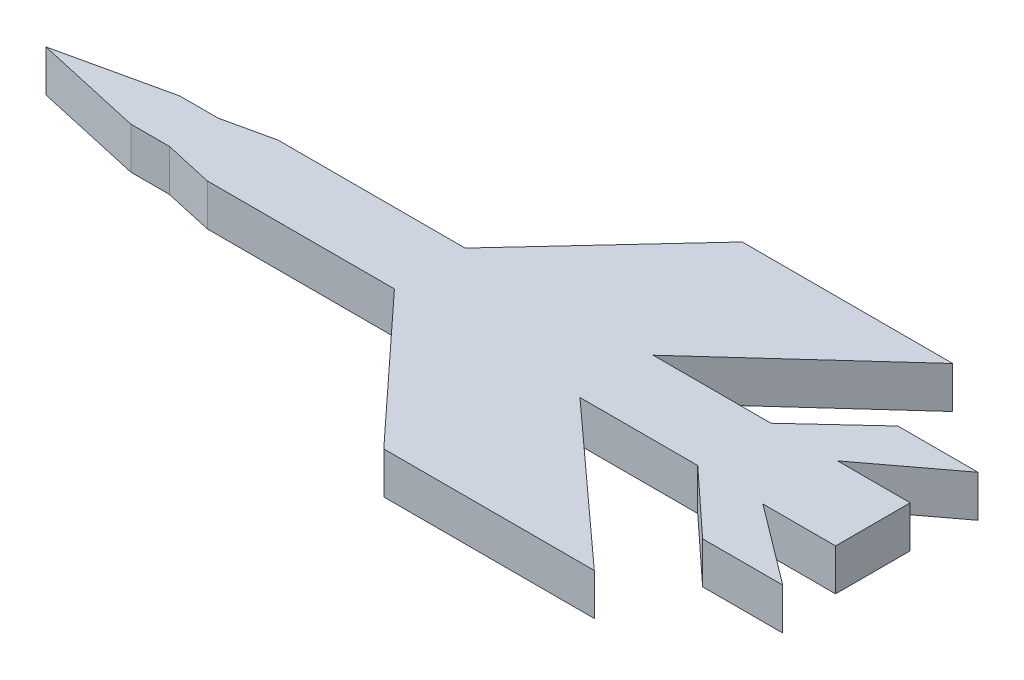
ISO-10303-21;
HEADER;
FILE_DESCRIPTION(('STEP AP214'),'2;1');
FILE_NAME('part.step','',(''),(''),'','','');
FILE_SCHEMA(('AUTOMOTIVE_DESIGN { 1 0 10303 214 1 1 1 1 }'));
ENDSEC;
DATA;
#1=APPLICATION_CONTEXT('core data for automotive mechanical design processes');
#2=APPLICATION_PROTOCOL_DEFINITION('international standard','automotive_design',2000,#1);
#3=PRODUCT_CONTEXT('',#1,'mechanical');
#4=PRODUCT('Part','Part','',(#3));
#5=PRODUCT_RELATED_PRODUCT_CATEGORY('part','',(#4));
#6=PRODUCT_DEFINITION_FORMATION('','',#4);
#7=PRODUCT_DEFINITION_CONTEXT('part definition',#1,'design');
#8=PRODUCT_DEFINITION('design','',#6,#7);
#9=PRODUCT_DEFINITION_SHAPE('','',#8);
#10=(LENGTH_UNIT() NAMED_UNIT(*) SI_UNIT(.MILLI.,.METRE.));
#11=(NAMED_UNIT(*) PLANE_ANGLE_UNIT() SI_UNIT($,.RADIAN.));
#12=(NAMED_UNIT(*) SI_UNIT($,.STERADIAN.) SOLID_ANGLE_UNIT());
#13=UNCERTAINTY_MEASURE_WITH_UNIT(LENGTH_MEASURE(1.E-05),#10,'distance_accuracy_value','');
#14=(GEOMETRIC_REPRESENTATION_CONTEXT(3) GLOBAL_UNCERTAINTY_ASSIGNED_CONTEXT((#13)) GLOBAL_UNIT_ASSIGNED_CONTEXT((#10,
#11,#12)) REPRESENTATION_CONTEXT('',''));
#15=CARTESIAN_POINT('',(0.,0.,0.));
#16=DIRECTION('',(0.,0.,1.));
#17=DIRECTION('',(1.,0.,0.));
#18=AXIS2_PLACEMENT_3D('',#15,#16,#17);
#19=CARTESIAN_POINT('',(2.19655905326022,2.,0.));
#20=DIRECTION('',(0.218155907395046,0.,-0.975913930666349));
#21=DIRECTION('',(-0.975913930666349,0.,-0.218155907395046));
#22=AXIS2_PLACEMENT_3D('',#19,#20,#21);
#23=PLANE('',#22);
#24=DIRECTION('',(0.975913930666349,0.,0.218155907395046));
#25=VECTOR('',#24,1.);
#26=CARTESIAN_POINT('',(2.19655905326022,0.,0.));
#27=LINE('',#26,#25);
#28=CARTESIAN_POINT('',(2.19655905326022,0.,0.));
#29=VERTEX_POINT('',#28);
#30=CARTESIAN_POINT('',(7.45293129646285,0.,1.17501002935683));
#31=VERTEX_POINT('',#30);
#32=EDGE_CURVE('E242',#29,#31,#27,.T.);
#33=ORIENTED_EDGE('',*,*,#32,.T.);
#34=DIRECTION('',(0.,-1.,0.));
#35=VECTOR('',#34,1.);
#36=CARTESIAN_POINT('',(7.45293129646285,2.,1.17501002935683));
#37=LINE('',#36,#35);
#38=CARTESIAN_POINT('',(7.45293129646285,2.,1.17501002935683));
#39=VERTEX_POINT('',#38);
#40=EDGE_CURVE('E11',#39,#31,#37,.T.);
#41=ORIENTED_EDGE('',*,*,#40,.F.);
#42=DIRECTION('',(0.975913930666349,0.,0.218155907395046));
#43=VECTOR('',#42,1.);
#44=CARTESIAN_POINT('',(2.19655905326022,2.,0.));
#45=LINE('',#44,#43);
#46=CARTESIAN_POINT('',(2.19655905326022,2.,0.));
#47=VERTEX_POINT('',#46);
#48=EDGE_CURVE('E315',#47,#39,#45,.T.);
#49=ORIENTED_EDGE('',*,*,#48,.F.);
#50=DIRECTION('',(0.,-1.,0.));
#51=VECTOR('',#50,1.);
#52=CARTESIAN_POINT('',(2.19655905326022,2.,0.));
#53=LINE('',#52,#51);
#54=EDGE_CURVE('E238',#47,#29,#53,.T.);
#55=ORIENTED_EDGE('',*,*,#54,.T.);
#56=EDGE_LOOP('',(#33,#41,#49,#55));
#57=FACE_BOUND('',#56,.T.);
#58=ADVANCED_FACE('F39',(#57),#23,.F.);
#59=CARTESIAN_POINT('',(7.45293129646285,2.,1.17501002935683));
#60=DIRECTION('',(0.,0.,-1.));
#61=DIRECTION('',(-1.,0.,0.));
#62=AXIS2_PLACEMENT_3D('',#59,#60,#61);
#63=PLANE('',#62);
#64=DIRECTION('',(1.,0.,0.));
#65=VECTOR('',#64,1.);
#66=CARTESIAN_POINT('',(7.45293129646285,0.,1.17501002935683));
#67=LINE('',#66,#65);
#68=CARTESIAN_POINT('',(9.30359409427219,0.,1.17501002935683));
#69=VERTEX_POINT('',#68);
#70=EDGE_CURVE('E246',#31,#69,#67,.T.);
#71=ORIENTED_EDGE('',*,*,#70,.T.);
#72=DIRECTION('',(0.,-1.,0.));
#73=VECTOR('',#72,1.);
#74=CARTESIAN_POINT('',(9.30359409427219,2.,1.17501002935683));
#75=LINE('',#74,#73);
#76=CARTESIAN_POINT('',(9.30359409427219,2.,1.17501002935683));
#77=VERTEX_POINT('',#76);
#78=EDGE_CURVE('E48',#77,#69,#75,.T.);
#79=ORIENTED_EDGE('',*,*,#78,.F.);
#80=DIRECTION('',(1.,0.,0.));
#81=VECTOR('',#80,1.);
#82=CARTESIAN_POINT('',(7.45293129646285,2.,1.17501002935683));
#83=LINE('',#82,#81);
#84=EDGE_CURVE('E150',#39,#77,#83,.T.);
#85=ORIENTED_EDGE('',*,*,#84,.F.);
#86=ORIENTED_EDGE('',*,*,#40,.T.);
#87=EDGE_LOOP('',(#71,#79,#85,#86));
#88=FACE_BOUND('',#87,.T.);
#89=ADVANCED_FACE('F500',(#88),#63,.F.);
#90=CARTESIAN_POINT('',(9.30359409427219,2.,1.17501002935683));
#91=DIRECTION('',(0.218155907395046,0.,-0.975913930666349));
#92=DIRECTION('',(-0.975913930666349,0.,-0.218155907395046));
#93=AXIS2_PLACEMENT_3D('',#90,#91,#92);
#94=PLANE('',#93);
#95=DIRECTION('',(0.975913930666349,0.,0.218155907395046));
#96=VECTOR('',#95,1.);
#97=CARTESIAN_POINT('',(9.30359409427219,0.,1.17501002935683));
#98=LINE('',#97,#96);
#99=CARTESIAN_POINT('',(11.6510988990228,0.,1.69977151159628));
#100=VERTEX_POINT('',#99);
#101=EDGE_CURVE('E249',#69,#100,#98,.T.);
#102=ORIENTED_EDGE('',*,*,#101,.T.);
#103=DIRECTION('',(0.,-1.,0.));
#104=VECTOR('',#103,1.);
#105=CARTESIAN_POINT('',(11.6510988990228,2.,1.69977151159628));
#106=LINE('',#105,#104);
#107=CARTESIAN_POINT('',(11.6510988990228,2.,1.69977151159628));
#108=VERTEX_POINT('',#107);
#109=EDGE_CURVE('E394',#108,#100,#106,.T.);
#110=ORIENTED_EDGE('',*,*,#109,.F.);
#111=DIRECTION('',(0.975913930666349,0.,0.218155907395046));
#112=VECTOR('',#111,1.);
#113=CARTESIAN_POINT('',(9.30359409427219,2.,1.17501002935683));
#114=LINE('',#113,#112);
#115=EDGE_CURVE('E404',#77,#108,#114,.T.);
#116=ORIENTED_EDGE('',*,*,#115,.F.);
#117=ORIENTED_EDGE('',*,*,#78,.T.);
#118=EDGE_LOOP('',(#102,#110,#116,#117));
#119=FACE_BOUND('',#118,.T.);
#120=ADVANCED_FACE('F402',(#119),#94,.F.);
#121=CARTESIAN_POINT('',(11.6510988990228,2.,1.69977151159628));
#122=DIRECTION('',(0.,0.,-1.));
#123=DIRECTION('',(-1.,0.,0.));
#124=AXIS2_PLACEMENT_3D('',#121,#122,#123);
#125=PLANE('',#124);
#126=DIRECTION('',(1.,0.,0.));
#127=VECTOR('',#126,1.);
#128=CARTESIAN_POINT('',(11.6510988990228,0.,1.69977151159628));
#129=LINE('',#128,#127);
#130=CARTESIAN_POINT('',(20.6485779370225,0.,1.69977151159628));
#131=VERTEX_POINT('',#130);
#132=EDGE_CURVE('E252',#100,#131,#129,.T.);
#133=ORIENTED_EDGE('',*,*,#132,.T.);
#134=DIRECTION('',(0.,-1.,0.));
#135=VECTOR('',#134,1.);
#136=CARTESIAN_POINT('',(20.6485779370225,2.,1.69977151159628));
#137=LINE('',#136,#135);
#138=CARTESIAN_POINT('',(20.6485779370225,2.,1.69977151159628));
#139=VERTEX_POINT('',#138);
#140=EDGE_CURVE('E390',#139,#131,#137,.T.);
#141=ORIENTED_EDGE('',*,*,#140,.F.);
#142=DIRECTION('',(1.,0.,0.));
#143=VECTOR('',#142,1.);
#144=CARTESIAN_POINT('',(11.6510988990228,2.,1.69977151159628));
#145=LINE('',#144,#143);
#146=EDGE_CURVE('E423',#108,#139,#145,.T.);
#147=ORIENTED_EDGE('',*,*,#146,.F.);
#148=ORIENTED_EDGE('',*,*,#109,.T.);
#149=EDGE_LOOP('',(#133,#141,#147,#148));
#150=FACE_BOUND('',#149,.T.);
#151=ADVANCED_FACE('F413',(#150),#125,.F.);
#152=CARTESIAN_POINT('',(20.6485779370225,2.,1.69977151159628));
#153=DIRECTION('',(0.733707687649136,0.,-0.679465252301071));
#154=DIRECTION('',(-0.679465252301071,0.,-0.733707687649136));
#155=AXIS2_PLACEMENT_3D('',#152,#153,#154);
#156=PLANE('',#155);
#157=DIRECTION('',(0.679465252301071,0.,0.733707687649136));
#158=VECTOR('',#157,1.);
#159=CARTESIAN_POINT('',(20.6485779370225,0.,1.69977151159628));
#160=LINE('',#159,#158);
#161=CARTESIAN_POINT('',(27.0551507672145,0.,8.61778787972867));
#162=VERTEX_POINT('',#161);
#163=EDGE_CURVE('E255',#131,#162,#160,.T.);
#164=ORIENTED_EDGE('',*,*,#163,.T.);
#165=DIRECTION('',(0.,-1.,0.));
#166=VECTOR('',#165,1.);
#167=CARTESIAN_POINT('',(27.0551507672145,2.,8.61778787972867));
#168=LINE('',#167,#166);
#169=CARTESIAN_POINT('',(27.0551507672145,2.,8.61778787972867));
#170=VERTEX_POINT('',#169);
#171=EDGE_CURVE('E386',#170,#162,#168,.T.);
#172=ORIENTED_EDGE('',*,*,#171,.F.);
#173=DIRECTION('',(0.679465252301071,0.,0.733707687649136));
#174=VECTOR('',#173,1.);
#175=CARTESIAN_POINT('',(20.6485779370225,2.,1.69977151159628));
#176=LINE('',#175,#174);
#177=EDGE_CURVE('E419',#139,#170,#176,.T.);
#178=ORIENTED_EDGE('',*,*,#177,.F.);
#179=ORIENTED_EDGE('',*,*,#140,.T.);
#180=EDGE_LOOP('',(#164,#172,#178,#179));
#181=FACE_BOUND('',#180,.T.);
#182=ADVANCED_FACE('F417',(#181),#156,.F.);
#183=CARTESIAN_POINT('',(27.0551507672145,2.,8.61778787972867));
#184=DIRECTION('',(0.,0.,-1.));
#185=DIRECTION('',(-1.,0.,0.));
#186=AXIS2_PLACEMENT_3D('',#183,#184,#185);
#187=PLANE('',#186);
#188=DIRECTION('',(1.,0.,0.));
#189=VECTOR('',#188,1.);
#190=CARTESIAN_POINT('',(27.0551507672145,0.,8.61778787972867));
#191=LINE('',#190,#189);
#192=CARTESIAN_POINT('',(37.1766319500149,0.,8.61778787972867));
#193=VERTEX_POINT('',#192);
#194=EDGE_CURVE('E258',#162,#193,#191,.T.);
#195=ORIENTED_EDGE('',*,*,#194,.T.);
#196=DIRECTION('',(0.,-1.,0.));
#197=VECTOR('',#196,1.);
#198=CARTESIAN_POINT('',(37.1766319500149,2.,8.61778787972867));
#199=LINE('',#198,#197);
#200=CARTESIAN_POINT('',(37.1766319500149,2.,8.61778787972867));
#201=VERTEX_POINT('',#200);
#202=EDGE_CURVE('E382',#201,#193,#199,.T.);
#203=ORIENTED_EDGE('',*,*,#202,.F.);
#204=DIRECTION('',(1.,0.,0.));
#205=VECTOR('',#204,1.);
#206=CARTESIAN_POINT('',(27.0551507672145,2.,8.61778787972867));
#207=LINE('',#206,#205);
#208=EDGE_CURVE('E422',#170,#201,#207,.T.);
#209=ORIENTED_EDGE('',*,*,#208,.F.);
#210=ORIENTED_EDGE('',*,*,#171,.T.);
#211=EDGE_LOOP('',(#195,#203,#209,#210));
#212=FACE_BOUND('',#211,.T.);
#213=ADVANCED_FACE('F513',(#212),#187,.F.);
#214=CARTESIAN_POINT('',(37.1766319500149,2.,8.61778787972867));
#215=DIRECTION('',(-0.672408894273598,0.,0.740179896310186));
#216=DIRECTION('',(0.740179896310186,0.,0.672408894273598));
#217=AXIS2_PLACEMENT_3D('',#214,#215,#216);
#218=PLANE('',#217);
#219=DIRECTION('',(-0.740179896310186,0.,-0.672408894273598));
#220=VECTOR('',#219,1.);
#221=CARTESIAN_POINT('',(37.1766319500149,0.,8.61778787972867));
#222=LINE('',#221,#220);
#223=CARTESIAN_POINT('',(29.6276479759605,0.,1.75999021163875));
#224=VERTEX_POINT('',#223);
#225=EDGE_CURVE('E261',#193,#224,#222,.T.);
#226=ORIENTED_EDGE('',*,*,#225,.T.);
#227=DIRECTION('',(0.,-1.,0.));
#228=VECTOR('',#227,1.);
#229=CARTESIAN_POINT('',(29.6276479759605,2.,1.75999021163875));
#230=LINE('',#229,#228);
#231=CARTESIAN_POINT('',(29.6276479759605,2.,1.75999021163875));
#232=VERTEX_POINT('',#231);
#233=EDGE_CURVE('E378',#232,#224,#230,.T.);
#234=ORIENTED_EDGE('',*,*,#233,.F.);
#235=DIRECTION('',(-0.740179896310186,0.,-0.672408894273598));
#236=VECTOR('',#235,1.);
#237=CARTESIAN_POINT('',(37.1766319500149,2.,8.61778787972867));
#238=LINE('',#237,#236);
#239=EDGE_CURVE('E427',#201,#232,#238,.T.);
#240=ORIENTED_EDGE('',*,*,#239,.F.);
#241=ORIENTED_EDGE('',*,*,#202,.T.);
#242=EDGE_LOOP('',(#226,#234,#240,#241));
#243=FACE_BOUND('',#242,.T.);
#244=ADVANCED_FACE('F516',(#243),#218,.F.);
#245=CARTESIAN_POINT('',(29.6276479759605,2.,1.75999021163875));
#246=DIRECTION('',(0.,0.,-1.));
#247=DIRECTION('',(-1.,0.,0.));
#248=AXIS2_PLACEMENT_3D('',#245,#246,#247);
#249=PLANE('',#248);
#250=DIRECTION('',(1.,0.,0.));
#251=VECTOR('',#250,1.);
#252=CARTESIAN_POINT('',(29.6276479759605,0.,1.75999021163875));
#253=LINE('',#252,#251);
#254=CARTESIAN_POINT('',(35.2924500422647,0.,1.75999021163875));
#255=VERTEX_POINT('',#254);
#256=EDGE_CURVE('E264',#224,#255,#253,.T.);
#257=ORIENTED_EDGE('',*,*,#256,.T.);
#258=DIRECTION('',(0.,-1.,0.));
#259=VECTOR('',#258,1.);
#260=CARTESIAN_POINT('',(35.2924500422647,2.,1.75999021163875));
#261=LINE('',#260,#259);
#262=CARTESIAN_POINT('',(35.2924500422647,2.,1.75999021163875));
#263=VERTEX_POINT('',#262);
#264=EDGE_CURVE('E374',#263,#255,#261,.T.);
#265=ORIENTED_EDGE('',*,*,#264,.F.);
#266=DIRECTION('',(1.,0.,0.));
#267=VECTOR('',#266,1.);
#268=CARTESIAN_POINT('',(29.6276479759605,2.,1.75999021163875));
#269=LINE('',#268,#267);
#270=EDGE_CURVE('E434',#232,#263,#269,.T.);
#271=ORIENTED_EDGE('',*,*,#270,.F.);
#272=ORIENTED_EDGE('',*,*,#233,.T.);
#273=EDGE_LOOP('',(#257,#265,#271,#272));
#274=FACE_BOUND('',#273,.T.);
#275=ADVANCED_FACE('F520',(#274),#249,.F.);
#276=CARTESIAN_POINT('',(35.2924500422647,2.,1.75999021163875));
#277=DIRECTION('',(0.679465252301071,0.,-0.733707687649136));
#278=DIRECTION('',(-0.733707687649136,0.,-0.679465252301071));
#279=AXIS2_PLACEMENT_3D('',#276,#277,#278);
#280=PLANE('',#279);
#281=DIRECTION('',(0.733707687649136,0.,0.679465252301071));
#282=VECTOR('',#281,1.);
#283=CARTESIAN_POINT('',(35.2924500422647,0.,1.75999021163875));
#284=LINE('',#283,#282);
#285=CARTESIAN_POINT('',(38.4617435893017,0.,4.69498036616941));
#286=VERTEX_POINT('',#285);
#287=EDGE_CURVE('E267',#255,#286,#284,.T.);
#288=ORIENTED_EDGE('',*,*,#287,.T.);
#289=DIRECTION('',(0.,-1.,0.));
#290=VECTOR('',#289,1.);
#291=CARTESIAN_POINT('',(38.4617435893017,2.,4.69498036616941));
#292=LINE('',#291,#290);
#293=CARTESIAN_POINT('',(38.4617435893017,2.,4.69498036616941));
#294=VERTEX_POINT('',#293);
#295=EDGE_CURVE('E370',#294,#286,#292,.T.);
#296=ORIENTED_EDGE('',*,*,#295,.F.);
#297=DIRECTION('',(0.733707687649136,0.,0.679465252301071));
#298=VECTOR('',#297,1.);
#299=CARTESIAN_POINT('',(35.2924500422647,2.,1.75999021163875));
#300=LINE('',#299,#298);
#301=EDGE_CURVE('E437',#263,#294,#300,.T.);
#302=ORIENTED_EDGE('',*,*,#301,.F.);
#303=ORIENTED_EDGE('',*,*,#264,.T.);
#304=EDGE_LOOP('',(#288,#296,#302,#303));
#305=FACE_BOUND('',#304,.T.);
#306=ADVANCED_FACE('F524',(#305),#280,.F.);
#307=CARTESIAN_POINT('',(38.4617435893017,2.,4.69498036616941));
#308=DIRECTION('',(0.,0.,-1.));
#309=DIRECTION('',(-1.,0.,0.));
#310=AXIS2_PLACEMENT_3D('',#307,#308,#309);
#311=PLANE('',#310);
#312=DIRECTION('',(1.,0.,0.));
#313=VECTOR('',#312,1.);
#314=CARTESIAN_POINT('',(38.4617435893017,0.,4.69498036616941));
#315=LINE('',#314,#313);
#316=CARTESIAN_POINT('',(42.3137654765358,0.,4.69498036616941));
#317=VERTEX_POINT('',#316);
#318=EDGE_CURVE('E270',#286,#317,#315,.T.);
#319=ORIENTED_EDGE('',*,*,#318,.T.);
#320=DIRECTION('',(0.,-1.,0.));
#321=VECTOR('',#320,1.);
#322=CARTESIAN_POINT('',(42.3137654765358,2.,4.69498036616941));
#323=LINE('',#322,#321);
#324=CARTESIAN_POINT('',(42.3137654765358,2.,4.69498036616941));
#325=VERTEX_POINT('',#324);
#326=EDGE_CURVE('E366',#325,#317,#323,.T.);
#327=ORIENTED_EDGE('',*,*,#326,.F.);
#328=DIRECTION('',(1.,0.,0.));
#329=VECTOR('',#328,1.);
#330=CARTESIAN_POINT('',(38.4617435893017,2.,4.69498036616941));
#331=LINE('',#330,#329);
#332=EDGE_CURVE('E440',#294,#325,#331,.T.);
#333=ORIENTED_EDGE('',*,*,#332,.F.);
#334=ORIENTED_EDGE('',*,*,#295,.T.);
#335=EDGE_LOOP('',(#319,#327,#333,#334));
#336=FACE_BOUND('',#335,.T.);
#337=ADVANCED_FACE('F528',(#336),#311,.F.);
#338=CARTESIAN_POINT('',(42.3137654765358,2.,4.69498036616941));
#339=DIRECTION('',(-0.601543490900875,0.,0.798840051922028));
#340=DIRECTION('',(0.798840051922028,0.,0.601543490900875));
#341=AXIS2_PLACEMENT_3D('',#338,#339,#340);
#342=PLANE('',#341);
#343=DIRECTION('',(-0.798840051922028,0.,-0.601543490900875));
#344=VECTOR('',#343,1.);
#345=CARTESIAN_POINT('',(42.3137654765358,0.,4.69498036616941));
#346=LINE('',#345,#344);
#347=CARTESIAN_POINT('',(38.4617435893017,0.,1.79432623960403));
#348=VERTEX_POINT('',#347);
#349=EDGE_CURVE('E273',#317,#348,#346,.T.);
#350=ORIENTED_EDGE('',*,*,#349,.T.);
#351=DIRECTION('',(0.,-1.,0.));
#352=VECTOR('',#351,1.);
#353=CARTESIAN_POINT('',(38.4617435893017,2.,1.79432623960403));
#354=LINE('',#353,#352);
#355=CARTESIAN_POINT('',(38.4617435893017,2.,1.79432623960403));
#356=VERTEX_POINT('',#355);
#357=EDGE_CURVE('E362',#356,#348,#354,.T.);
#358=ORIENTED_EDGE('',*,*,#357,.F.);
#359=DIRECTION('',(-0.798840051922028,0.,-0.601543490900875));
#360=VECTOR('',#359,1.);
#361=CARTESIAN_POINT('',(42.3137654765358,2.,4.69498036616941));
#362=LINE('',#361,#360);
#363=EDGE_CURVE('E443',#325,#356,#362,.T.);
#364=ORIENTED_EDGE('',*,*,#363,.F.);
#365=ORIENTED_EDGE('',*,*,#326,.T.);
#366=EDGE_LOOP('',(#350,#358,#364,#365));
#367=FACE_BOUND('',#366,.T.);
#368=ADVANCED_FACE('F532',(#367),#342,.F.);
#369=CARTESIAN_POINT('',(38.4617435893017,2.,1.79432623960403));
#370=DIRECTION('',(0.,0.,-1.));
#371=DIRECTION('',(-1.,0.,0.));
#372=AXIS2_PLACEMENT_3D('',#369,#370,#371);
#373=PLANE('',#372);
#374=DIRECTION('',(1.,0.,0.));
#375=VECTOR('',#374,1.);
#376=CARTESIAN_POINT('',(38.4617435893017,0.,1.79432623960403));
#377=LINE('',#376,#375);
#378=CARTESIAN_POINT('',(41.9551928770915,0.,1.79432623960403));
#379=VERTEX_POINT('',#378);
#380=EDGE_CURVE('E276',#348,#379,#377,.T.);
#381=ORIENTED_EDGE('',*,*,#380,.T.);
#382=DIRECTION('',(0.,-1.,0.));
#383=VECTOR('',#382,1.);
#384=CARTESIAN_POINT('',(41.9551928770915,2.,1.79432623960403));
#385=LINE('',#384,#383);
#386=CARTESIAN_POINT('',(41.9551928770915,2.,1.79432623960403));
#387=VERTEX_POINT('',#386);
#388=EDGE_CURVE('E358',#387,#379,#385,.T.);
#389=ORIENTED_EDGE('',*,*,#388,.F.);
#390=DIRECTION('',(1.,0.,0.));
#391=VECTOR('',#390,1.);
#392=CARTESIAN_POINT('',(38.4617435893017,2.,1.79432623960403));
#393=LINE('',#392,#391);
#394=EDGE_CURVE('E446',#356,#387,#393,.T.);
#395=ORIENTED_EDGE('',*,*,#394,.F.);
#396=ORIENTED_EDGE('',*,*,#357,.T.);
#397=EDGE_LOOP('',(#381,#389,#395,#396));
#398=FACE_BOUND('',#397,.T.);
#399=ADVANCED_FACE('F536',(#398),#373,.F.);
#400=CARTESIAN_POINT('',(41.9551928770915,2.,-1.79432623960403));
#401=DIRECTION('',(-1.,0.,0.));
#402=DIRECTION('',(0.,0.,1.));
#403=AXIS2_PLACEMENT_3D('',#400,#401,#402);
#404=PLANE('',#403);
#405=DIRECTION('',(0.,0.,-1.));
#406=VECTOR('',#405,1.);
#407=CARTESIAN_POINT('',(41.9551928770915,0.,-1.79432623960403));
#408=LINE('',#407,#406);
#409=CARTESIAN_POINT('',(41.9551928770915,0.,-1.79432623960403));
#410=VERTEX_POINT('',#409);
#411=EDGE_CURVE('E279',#379,#410,#408,.T.);
#412=ORIENTED_EDGE('',*,*,#411,.T.);
#413=DIRECTION('',(0.,-1.,0.));
#414=VECTOR('',#413,1.);
#415=CARTESIAN_POINT('',(41.9551928770915,2.,-1.79432623960403));
#416=LINE('',#415,#414);
#417=CARTESIAN_POINT('',(41.9551928770915,2.,-1.79432623960403));
#418=VERTEX_POINT('',#417);
#419=EDGE_CURVE('E354',#418,#410,#416,.T.);
#420=ORIENTED_EDGE('',*,*,#419,.F.);
#421=DIRECTION('',(0.,0.,-1.));
#422=VECTOR('',#421,1.);
#423=CARTESIAN_POINT('',(41.9551928770915,2.,-1.79432623960403));
#424=LINE('',#423,#422);
#425=EDGE_CURVE('E449',#387,#418,#424,.T.);
#426=ORIENTED_EDGE('',*,*,#425,.F.);
#427=ORIENTED_EDGE('',*,*,#388,.T.);
#428=EDGE_LOOP('',(#412,#420,#426,#427));
#429=FACE_BOUND('',#428,.T.);
#430=ADVANCED_FACE('F540',(#429),#404,.F.);
#431=CARTESIAN_POINT('',(38.4617435893017,2.,-1.79432623960403));
#432=DIRECTION('',(0.,0.,1.));
#433=DIRECTION('',(1.,0.,0.));
#434=AXIS2_PLACEMENT_3D('',#431,#432,#433);
#435=PLANE('',#434);
#436=DIRECTION('',(-1.,0.,0.));
#437=VECTOR('',#436,1.);
#438=CARTESIAN_POINT('',(38.4617435893017,0.,-1.79432623960403));
#439=LINE('',#438,#437);
#440=CARTESIAN_POINT('',(38.4617435893017,0.,-1.79432623960403));
#441=VERTEX_POINT('',#440);
#442=EDGE_CURVE('E282',#410,#441,#439,.T.);
#443=ORIENTED_EDGE('',*,*,#442,.T.);
#444=DIRECTION('',(0.,-1.,0.));
#445=VECTOR('',#444,1.);
#446=CARTESIAN_POINT('',(38.4617435893017,2.,-1.79432623960403));
#447=LINE('',#446,#445);
#448=CARTESIAN_POINT('',(38.4617435893017,2.,-1.79432623960403));
#449=VERTEX_POINT('',#448);
#450=EDGE_CURVE('E350',#449,#441,#447,.T.);
#451=ORIENTED_EDGE('',*,*,#450,.F.);
#452=DIRECTION('',(-1.,0.,0.));
#453=VECTOR('',#452,1.);
#454=CARTESIAN_POINT('',(38.4617435893017,2.,-1.79432623960403));
#455=LINE('',#454,#453);
#456=EDGE_CURVE('E452',#418,#449,#455,.T.);
#457=ORIENTED_EDGE('',*,*,#456,.F.);
#458=ORIENTED_EDGE('',*,*,#419,.T.);
#459=EDGE_LOOP('',(#443,#451,#457,#458));
#460=FACE_BOUND('',#459,.T.);
#461=ADVANCED_FACE('F544',(#460),#435,.F.);
#462=CARTESIAN_POINT('',(42.3137654765358,2.,-4.69498036616941));
#463=DIRECTION('',(-0.601543490900875,0.,-0.798840051922028));
#464=DIRECTION('',(-0.798840051922028,0.,0.601543490900875));
#465=AXIS2_PLACEMENT_3D('',#462,#463,#464);
#466=PLANE('',#465);
#467=DIRECTION('',(0.798840051922028,0.,-0.601543490900875));
#468=VECTOR('',#467,1.);
#469=CARTESIAN_POINT('',(42.3137654765358,0.,-4.69498036616941));
#470=LINE('',#469,#468);
#471=CARTESIAN_POINT('',(42.3137654765358,0.,-4.69498036616941));
#472=VERTEX_POINT('',#471);
#473=EDGE_CURVE('E285',#441,#472,#470,.T.);
#474=ORIENTED_EDGE('',*,*,#473,.T.);
#475=DIRECTION('',(0.,-1.,0.));
#476=VECTOR('',#475,1.);
#477=CARTESIAN_POINT('',(42.3137654765358,2.,-4.69498036616941));
#478=LINE('',#477,#476);
#479=CARTESIAN_POINT('',(42.3137654765358,2.,-4.69498036616941));
#480=VERTEX_POINT('',#479);
#481=EDGE_CURVE('E346',#480,#472,#478,.T.);
#482=ORIENTED_EDGE('',*,*,#481,.F.);
#483=DIRECTION('',(0.798840051922028,0.,-0.601543490900875));
#484=VECTOR('',#483,1.);
#485=CARTESIAN_POINT('',(42.3137654765358,2.,-4.69498036616941));
#486=LINE('',#485,#484);
#487=EDGE_CURVE('E455',#449,#480,#486,.T.);
#488=ORIENTED_EDGE('',*,*,#487,.F.);
#489=ORIENTED_EDGE('',*,*,#450,.T.);
#490=EDGE_LOOP('',(#474,#482,#488,#489));
#491=FACE_BOUND('',#490,.T.);
#492=ADVANCED_FACE('F548',(#491),#466,.F.);
#493=CARTESIAN_POINT('',(38.4617435893017,2.,-4.69498036616941));
#494=DIRECTION('',(0.,0.,1.));
#495=DIRECTION('',(1.,0.,0.));
#496=AXIS2_PLACEMENT_3D('',#493,#494,#495);
#497=PLANE('',#496);
#498=DIRECTION('',(-1.,0.,0.));
#499=VECTOR('',#498,1.);
#500=CARTESIAN_POINT('',(38.4617435893017,0.,-4.69498036616941));
#501=LINE('',#500,#499);
#502=CARTESIAN_POINT('',(38.4617435893017,0.,-4.69498036616941));
#503=VERTEX_POINT('',#502);
#504=EDGE_CURVE('E288',#472,#503,#501,.T.);
#505=ORIENTED_EDGE('',*,*,#504,.T.);
#506=DIRECTION('',(0.,-1.,0.));
#507=VECTOR('',#506,1.);
#508=CARTESIAN_POINT('',(38.4617435893017,2.,-4.69498036616941));
#509=LINE('',#508,#507);
#510=CARTESIAN_POINT('',(38.4617435893017,2.,-4.69498036616941));
#511=VERTEX_POINT('',#510);
#512=EDGE_CURVE('E342',#511,#503,#509,.T.);
#513=ORIENTED_EDGE('',*,*,#512,.F.);
#514=DIRECTION('',(-1.,0.,0.));
#515=VECTOR('',#514,1.);
#516=CARTESIAN_POINT('',(38.4617435893017,2.,-4.69498036616941));
#517=LINE('',#516,#515);
#518=EDGE_CURVE('E458',#480,#511,#517,.T.);
#519=ORIENTED_EDGE('',*,*,#518,.F.);
#520=ORIENTED_EDGE('',*,*,#481,.T.);
#521=EDGE_LOOP('',(#505,#513,#519,#520));
#522=FACE_BOUND('',#521,.T.);
#523=ADVANCED_FACE('F552',(#522),#497,.F.);
#524=CARTESIAN_POINT('',(35.2924500422647,2.,-1.75999021163875));
#525=DIRECTION('',(0.679465252301071,0.,0.733707687649136));
#526=DIRECTION('',(0.733707687649136,0.,-0.679465252301071));
#527=AXIS2_PLACEMENT_3D('',#524,#525,#526);
#528=PLANE('',#527);
#529=DIRECTION('',(-0.733707687649136,0.,0.679465252301071));
#530=VECTOR('',#529,1.);
#531=CARTESIAN_POINT('',(35.2924500422647,0.,-1.75999021163875));
#532=LINE('',#531,#530);
#533=CARTESIAN_POINT('',(35.2924500422647,0.,-1.75999021163875));
#534=VERTEX_POINT('',#533);
#535=EDGE_CURVE('E291',#503,#534,#532,.T.);
#536=ORIENTED_EDGE('',*,*,#535,.T.);
#537=DIRECTION('',(0.,-1.,0.));
#538=VECTOR('',#537,1.);
#539=CARTESIAN_POINT('',(35.2924500422647,2.,-1.75999021163875));
#540=LINE('',#539,#538);
#541=CARTESIAN_POINT('',(35.2924500422647,2.,-1.75999021163875));
#542=VERTEX_POINT('',#541);
#543=EDGE_CURVE('E338',#542,#534,#540,.T.);
#544=ORIENTED_EDGE('',*,*,#543,.F.);
#545=DIRECTION('',(-0.733707687649136,0.,0.679465252301071));
#546=VECTOR('',#545,1.);
#547=CARTESIAN_POINT('',(35.2924500422647,2.,-1.75999021163875));
#548=LINE('',#547,#546);
#549=EDGE_CURVE('E461',#511,#542,#548,.T.);
#550=ORIENTED_EDGE('',*,*,#549,.F.);
#551=ORIENTED_EDGE('',*,*,#512,.T.);
#552=EDGE_LOOP('',(#536,#544,#550,#551));
#553=FACE_BOUND('',#552,.T.);
#554=ADVANCED_FACE('F556',(#553),#528,.F.);
#555=CARTESIAN_POINT('',(29.6276479759605,2.,-1.75999021163875));
#556=DIRECTION('',(0.,0.,1.));
#557=DIRECTION('',(1.,0.,0.));
#558=AXIS2_PLACEMENT_3D('',#555,#556,#557);
#559=PLANE('',#558);
#560=DIRECTION('',(-1.,0.,0.));
#561=VECTOR('',#560,1.);
#562=CARTESIAN_POINT('',(29.6276479759605,0.,-1.75999021163875));
#563=LINE('',#562,#561);
#564=CARTESIAN_POINT('',(29.6276479759605,0.,-1.75999021163875));
#565=VERTEX_POINT('',#564);
#566=EDGE_CURVE('E294',#534,#565,#563,.T.);
#567=ORIENTED_EDGE('',*,*,#566,.T.);
#568=DIRECTION('',(0.,-1.,0.));
#569=VECTOR('',#568,1.);
#570=CARTESIAN_POINT('',(29.6276479759605,2.,-1.75999021163875));
#571=LINE('',#570,#569);
#572=CARTESIAN_POINT('',(29.6276479759605,2.,-1.75999021163875));
#573=VERTEX_POINT('',#572);
#574=EDGE_CURVE('E334',#573,#565,#571,.T.);
#575=ORIENTED_EDGE('',*,*,#574,.F.);
#576=DIRECTION('',(-1.,0.,0.));
#577=VECTOR('',#576,1.);
#578=CARTESIAN_POINT('',(29.6276479759605,2.,-1.75999021163875));
#579=LINE('',#578,#577);
#580=EDGE_CURVE('E464',#542,#573,#579,.T.);
#581=ORIENTED_EDGE('',*,*,#580,.F.);
#582=ORIENTED_EDGE('',*,*,#543,.T.);
#583=EDGE_LOOP('',(#567,#575,#581,#582));
#584=FACE_BOUND('',#583,.T.);
#585=ADVANCED_FACE('F560',(#584),#559,.F.);
#586=CARTESIAN_POINT('',(37.1766319500149,2.,-8.61778787972867));
#587=DIRECTION('',(-0.672408894273598,0.,-0.740179896310186));
#588=DIRECTION('',(-0.740179896310186,0.,0.672408894273598));
#589=AXIS2_PLACEMENT_3D('',#586,#587,#588);
#590=PLANE('',#589);
#591=DIRECTION('',(0.740179896310186,0.,-0.672408894273598));
#592=VECTOR('',#591,1.);
#593=CARTESIAN_POINT('',(37.1766319500149,0.,-8.61778787972867));
#594=LINE('',#593,#592);
#595=CARTESIAN_POINT('',(37.1766319500149,0.,-8.61778787972867));
#596=VERTEX_POINT('',#595);
#597=EDGE_CURVE('E297',#565,#596,#594,.T.);
#598=ORIENTED_EDGE('',*,*,#597,.T.);
#599=DIRECTION('',(0.,-1.,0.));
#600=VECTOR('',#599,1.);
#601=CARTESIAN_POINT('',(37.1766319500149,2.,-8.61778787972867));
#602=LINE('',#601,#600);
#603=CARTESIAN_POINT('',(37.1766319500149,2.,-8.61778787972867));
#604=VERTEX_POINT('',#603);
#605=EDGE_CURVE('E330',#604,#596,#602,.T.);
#606=ORIENTED_EDGE('',*,*,#605,.F.);
#607=DIRECTION('',(0.740179896310186,0.,-0.672408894273598));
#608=VECTOR('',#607,1.);
#609=CARTESIAN_POINT('',(37.1766319500149,2.,-8.61778787972867));
#610=LINE('',#609,#608);
#611=EDGE_CURVE('E467',#573,#604,#610,.T.);
#612=ORIENTED_EDGE('',*,*,#611,.F.);
#613=ORIENTED_EDGE('',*,*,#574,.T.);
#614=EDGE_LOOP('',(#598,#606,#612,#613));
#615=FACE_BOUND('',#614,.T.);
#616=ADVANCED_FACE('F564',(#615),#590,.F.);
#617=CARTESIAN_POINT('',(27.0551507672145,2.,-8.61778787972867));
#618=DIRECTION('',(0.,0.,1.));
#619=DIRECTION('',(1.,0.,0.));
#620=AXIS2_PLACEMENT_3D('',#617,#618,#619);
#621=PLANE('',#620);
#622=DIRECTION('',(-1.,0.,0.));
#623=VECTOR('',#622,1.);
#624=CARTESIAN_POINT('',(27.0551507672145,0.,-8.61778787972867));
#625=LINE('',#624,#623);
#626=CARTESIAN_POINT('',(27.0551507672145,0.,-8.61778787972867));
#627=VERTEX_POINT('',#626);
#628=EDGE_CURVE('E300',#596,#627,#625,.T.);
#629=ORIENTED_EDGE('',*,*,#628,.T.);
#630=DIRECTION('',(0.,-1.,0.));
#631=VECTOR('',#630,1.);
#632=CARTESIAN_POINT('',(27.0551507672145,2.,-8.61778787972867));
#633=LINE('',#632,#631);
#634=CARTESIAN_POINT('',(27.0551507672145,2.,-8.61778787972867));
#635=VERTEX_POINT('',#634);
#636=EDGE_CURVE('E326',#635,#627,#633,.T.);
#637=ORIENTED_EDGE('',*,*,#636,.F.);
#638=DIRECTION('',(-1.,0.,0.));
#639=VECTOR('',#638,1.);
#640=CARTESIAN_POINT('',(27.0551507672145,2.,-8.61778787972867));
#641=LINE('',#640,#639);
#642=EDGE_CURVE('E470',#604,#635,#641,.T.);
#643=ORIENTED_EDGE('',*,*,#642,.F.);
#644=ORIENTED_EDGE('',*,*,#605,.T.);
#645=EDGE_LOOP('',(#629,#637,#643,#644));
#646=FACE_BOUND('',#645,.T.);
#647=ADVANCED_FACE('F568',(#646),#621,.F.);
#648=CARTESIAN_POINT('',(20.6485779370225,2.,-1.69977151159628));
#649=DIRECTION('',(0.733707687649136,0.,0.679465252301071));
#650=DIRECTION('',(0.679465252301071,0.,-0.733707687649136));
#651=AXIS2_PLACEMENT_3D('',#648,#649,#650);
#652=PLANE('',#651);
#653=DIRECTION('',(-0.679465252301071,0.,0.733707687649136));
#654=VECTOR('',#653,1.);
#655=CARTESIAN_POINT('',(20.6485779370225,0.,-1.69977151159628));
#656=LINE('',#655,#654);
#657=CARTESIAN_POINT('',(20.6485779370225,0.,-1.69977151159628));
#658=VERTEX_POINT('',#657);
#659=EDGE_CURVE('E303',#627,#658,#656,.T.);
#660=ORIENTED_EDGE('',*,*,#659,.T.);
#661=DIRECTION('',(0.,-1.,0.));
#662=VECTOR('',#661,1.);
#663=CARTESIAN_POINT('',(20.6485779370225,2.,-1.69977151159628));
#664=LINE('',#663,#662);
#665=CARTESIAN_POINT('',(20.6485779370225,2.,-1.69977151159628));
#666=VERTEX_POINT('',#665);
#667=EDGE_CURVE('E322',#666,#658,#664,.T.);
#668=ORIENTED_EDGE('',*,*,#667,.F.);
#669=DIRECTION('',(-0.679465252301071,0.,0.733707687649136));
#670=VECTOR('',#669,1.);
#671=CARTESIAN_POINT('',(20.6485779370225,2.,-1.69977151159628));
#672=LINE('',#671,#670);
#673=EDGE_CURVE('E473',#635,#666,#672,.T.);
#674=ORIENTED_EDGE('',*,*,#673,.F.);
#675=ORIENTED_EDGE('',*,*,#636,.T.);
#676=EDGE_LOOP('',(#660,#668,#674,#675));
#677=FACE_BOUND('',#676,.T.);
#678=ADVANCED_FACE('F481',(#677),#652,.F.);
#679=CARTESIAN_POINT('',(11.6510988990228,2.,-1.69977151159628));
#680=DIRECTION('',(0.,0.,1.));
#681=DIRECTION('',(1.,0.,0.));
#682=AXIS2_PLACEMENT_3D('',#679,#680,#681);
#683=PLANE('',#682);
#684=DIRECTION('',(-1.,0.,0.));
#685=VECTOR('',#684,1.);
#686=CARTESIAN_POINT('',(11.6510988990228,0.,-1.69977151159628));
#687=LINE('',#686,#685);
#688=CARTESIAN_POINT('',(11.6510988990228,0.,-1.69977151159628));
#689=VERTEX_POINT('',#688);
#690=EDGE_CURVE('E306',#658,#689,#687,.T.);
#691=ORIENTED_EDGE('',*,*,#690,.T.);
#692=DIRECTION('',(0.,-1.,0.));
#693=VECTOR('',#692,1.);
#694=CARTESIAN_POINT('',(11.6510988990228,2.,-1.69977151159628));
#695=LINE('',#694,#693);
#696=CARTESIAN_POINT('',(11.6510988990228,2.,-1.69977151159628));
#697=VERTEX_POINT('',#696);
#698=EDGE_CURVE('E231',#697,#689,#695,.T.);
#699=ORIENTED_EDGE('',*,*,#698,.F.);
#700=DIRECTION('',(-1.,0.,0.));
#701=VECTOR('',#700,1.);
#702=CARTESIAN_POINT('',(11.6510988990228,2.,-1.69977151159628));
#703=LINE('',#702,#701);
#704=EDGE_CURVE('E220',#666,#697,#703,.T.);
#705=ORIENTED_EDGE('',*,*,#704,.F.);
#706=ORIENTED_EDGE('',*,*,#667,.T.);
#707=EDGE_LOOP('',(#691,#699,#705,#706));
#708=FACE_BOUND('',#707,.T.);
#709=ADVANCED_FACE('F485',(#708),#683,.F.);
#710=CARTESIAN_POINT('',(9.30359409427219,2.,-1.17501002935683));
#711=DIRECTION('',(0.218155907395046,0.,0.975913930666349));
#712=DIRECTION('',(0.975913930666349,0.,-0.218155907395046));
#713=AXIS2_PLACEMENT_3D('',#710,#711,#712);
#714=PLANE('',#713);
#715=DIRECTION('',(-0.975913930666349,0.,0.218155907395046));
#716=VECTOR('',#715,1.);
#717=CARTESIAN_POINT('',(9.30359409427219,0.,-1.17501002935683));
#718=LINE('',#717,#716);
#719=CARTESIAN_POINT('',(9.30359409427219,0.,-1.17501002935683));
#720=VERTEX_POINT('',#719);
#721=EDGE_CURVE('E229',#689,#720,#718,.T.);
#722=ORIENTED_EDGE('',*,*,#721,.T.);
#723=DIRECTION('',(0.,-1.,0.));
#724=VECTOR('',#723,1.);
#725=CARTESIAN_POINT('',(9.30359409427219,2.,-1.17501002935683));
#726=LINE('',#725,#724);
#727=CARTESIAN_POINT('',(9.30359409427219,2.,-1.17501002935683));
#728=VERTEX_POINT('',#727);
#729=EDGE_CURVE('E226',#728,#720,#726,.T.);
#730=ORIENTED_EDGE('',*,*,#729,.F.);
#731=DIRECTION('',(-0.975913930666349,0.,0.218155907395046));
#732=VECTOR('',#731,1.);
#733=CARTESIAN_POINT('',(9.30359409427219,2.,-1.17501002935683));
#734=LINE('',#733,#732);
#735=EDGE_CURVE('E214',#697,#728,#734,.T.);
#736=ORIENTED_EDGE('',*,*,#735,.F.);
#737=ORIENTED_EDGE('',*,*,#698,.T.);
#738=EDGE_LOOP('',(#722,#730,#736,#737));
#739=FACE_BOUND('',#738,.T.);
#740=ADVANCED_FACE('F227',(#739),#714,.F.);
#741=CARTESIAN_POINT('',(7.45293129646285,2.,-1.17501002935683));
#742=DIRECTION('',(0.,0.,1.));
#743=DIRECTION('',(1.,0.,0.));
#744=AXIS2_PLACEMENT_3D('',#741,#742,#743);
#745=PLANE('',#744);
#746=DIRECTION('',(-1.,0.,0.));
#747=VECTOR('',#746,1.);
#748=CARTESIAN_POINT('',(7.45293129646285,0.,-1.17501002935683));
#749=LINE('',#748,#747);
#750=CARTESIAN_POINT('',(7.45293129646285,0.,-1.17501002935683));
#751=VERTEX_POINT('',#750);
#752=EDGE_CURVE('E136',#720,#751,#749,.T.);
#753=ORIENTED_EDGE('',*,*,#752,.T.);
#754=DIRECTION('',(0.,-1.,0.));
#755=VECTOR('',#754,1.);
#756=CARTESIAN_POINT('',(7.45293129646285,2.,-1.17501002935683));
#757=LINE('',#756,#755);
#758=CARTESIAN_POINT('',(7.45293129646285,2.,-1.17501002935683));
#759=VERTEX_POINT('',#758);
#760=EDGE_CURVE('E232',#759,#751,#757,.T.);
#761=ORIENTED_EDGE('',*,*,#760,.F.);
#762=DIRECTION('',(-1.,0.,0.));
#763=VECTOR('',#762,1.);
#764=CARTESIAN_POINT('',(7.45293129646285,2.,-1.17501002935683));
#765=LINE('',#764,#763);
#766=EDGE_CURVE('E218',#728,#759,#765,.T.);
#767=ORIENTED_EDGE('',*,*,#766,.F.);
#768=ORIENTED_EDGE('',*,*,#729,.T.);
#769=EDGE_LOOP('',(#753,#761,#767,#768));
#770=FACE_BOUND('',#769,.T.);
#771=ADVANCED_FACE('F234',(#770),#745,.F.);
#772=CARTESIAN_POINT('',(2.19655905326022,2.,0.));
#773=DIRECTION('',(0.218155907395046,0.,0.975913930666349));
#774=DIRECTION('',(0.975913930666349,0.,-0.218155907395046));
#775=AXIS2_PLACEMENT_3D('',#772,#773,#774);
#776=PLANE('',#775);
#777=DIRECTION('',(-0.975913930666349,0.,0.218155907395046));
#778=VECTOR('',#777,1.);
#779=CARTESIAN_POINT('',(2.19655905326022,0.,0.));
#780=LINE('',#779,#778);
#781=EDGE_CURVE('E142',#751,#29,#780,.T.);
#782=ORIENTED_EDGE('',*,*,#781,.T.);
#783=ORIENTED_EDGE('',*,*,#54,.F.);
#784=DIRECTION('',(-0.975913930666349,0.,0.218155907395046));
#785=VECTOR('',#784,1.);
#786=CARTESIAN_POINT('',(2.19655905326022,2.,0.));
#787=LINE('',#786,#785);
#788=EDGE_CURVE('E56',#759,#47,#787,.T.);
#789=ORIENTED_EDGE('',*,*,#788,.F.);
#790=ORIENTED_EDGE('',*,*,#760,.T.);
#791=EDGE_LOOP('',(#782,#783,#789,#790));
#792=FACE_BOUND('',#791,.T.);
#793=ADVANCED_FACE('F489',(#792),#776,.F.);
#794=CARTESIAN_POINT('',(0.,2.,0.));
#795=DIRECTION('',(0.,-1.,0.));
#796=DIRECTION('',(0.,0.,-1.));
#797=AXIS2_PLACEMENT_3D('',#794,#795,#796);
#798=PLANE('',#797);
#799=ORIENTED_EDGE('',*,*,#48,.T.);
#800=ORIENTED_EDGE('',*,*,#84,.T.);
#801=ORIENTED_EDGE('',*,*,#115,.T.);
#802=ORIENTED_EDGE('',*,*,#146,.T.);
#803=ORIENTED_EDGE('',*,*,#177,.T.);
#804=ORIENTED_EDGE('',*,*,#208,.T.);
#805=ORIENTED_EDGE('',*,*,#239,.T.);
#806=ORIENTED_EDGE('',*,*,#270,.T.);
#807=ORIENTED_EDGE('',*,*,#301,.T.);
#808=ORIENTED_EDGE('',*,*,#332,.T.);
#809=ORIENTED_EDGE('',*,*,#363,.T.);
#810=ORIENTED_EDGE('',*,*,#394,.T.);
#811=ORIENTED_EDGE('',*,*,#425,.T.);
#812=ORIENTED_EDGE('',*,*,#456,.T.);
#813=ORIENTED_EDGE('',*,*,#487,.T.);
#814=ORIENTED_EDGE('',*,*,#518,.T.);
#815=ORIENTED_EDGE('',*,*,#549,.T.);
#816=ORIENTED_EDGE('',*,*,#580,.T.);
#817=ORIENTED_EDGE('',*,*,#611,.T.);
#818=ORIENTED_EDGE('',*,*,#642,.T.);
#819=ORIENTED_EDGE('',*,*,#673,.T.);
#820=ORIENTED_EDGE('',*,*,#704,.T.);
#821=ORIENTED_EDGE('',*,*,#735,.T.);
#822=ORIENTED_EDGE('',*,*,#766,.T.);
#823=ORIENTED_EDGE('',*,*,#788,.T.);
#824=EDGE_LOOP('',(#799,#800,#801,#802,#803,#804,#805,#806,#807,#808,#809,#810,#811,#812,#813,
#814,#815,#816,#817,#818,#819,#820,#821,#822,#823));
#825=FACE_BOUND('',#824,.T.);
#826=ADVANCED_FACE('F216',(#825),#798,.F.);
#827=CARTESIAN_POINT('',(0.,0.,0.));
#828=DIRECTION('',(0.,-1.,0.));
#829=DIRECTION('',(0.,0.,-1.));
#830=AXIS2_PLACEMENT_3D('',#827,#828,#829);
#831=PLANE('',#830);
#832=ORIENTED_EDGE('',*,*,#32,.F.);
#833=ORIENTED_EDGE('',*,*,#781,.F.);
#834=ORIENTED_EDGE('',*,*,#752,.F.);
#835=ORIENTED_EDGE('',*,*,#721,.F.);
#836=ORIENTED_EDGE('',*,*,#690,.F.);
#837=ORIENTED_EDGE('',*,*,#659,.F.);
#838=ORIENTED_EDGE('',*,*,#628,.F.);
#839=ORIENTED_EDGE('',*,*,#597,.F.);
#840=ORIENTED_EDGE('',*,*,#566,.F.);
#841=ORIENTED_EDGE('',*,*,#535,.F.);
#842=ORIENTED_EDGE('',*,*,#504,.F.);
#843=ORIENTED_EDGE('',*,*,#473,.F.);
#844=ORIENTED_EDGE('',*,*,#442,.F.);
#845=ORIENTED_EDGE('',*,*,#411,.F.);
#846=ORIENTED_EDGE('',*,*,#380,.F.);
#847=ORIENTED_EDGE('',*,*,#349,.F.);
#848=ORIENTED_EDGE('',*,*,#318,.F.);
#849=ORIENTED_EDGE('',*,*,#287,.F.);
#850=ORIENTED_EDGE('',*,*,#256,.F.);
#851=ORIENTED_EDGE('',*,*,#225,.F.);
#852=ORIENTED_EDGE('',*,*,#194,.F.);
#853=ORIENTED_EDGE('',*,*,#163,.F.);
#854=ORIENTED_EDGE('',*,*,#132,.F.);
#855=ORIENTED_EDGE('',*,*,#101,.F.);
#856=ORIENTED_EDGE('',*,*,#70,.F.);
#857=EDGE_LOOP('',(#832,#833,#834,#835,#836,#837,#838,#839,#840,#841,#842,#843,#844,#845,#846,
#847,#848,#849,#850,#851,#852,#853,#854,#855,#856));
#858=FACE_BOUND('',#857,.T.);
#859=ADVANCED_FACE('F408',(#858),#831,.T.);
#860=CLOSED_SHELL('',(#58,#89,#120,#151,#182,#213,#244,#275,#306,#337,#368,#399,#430,#461,#492,
#523,#554,#585,#616,#647,#678,#709,#740,#771,#793,#826,#859));
#861=MANIFOLD_SOLID_BREP('B2',#860);
#862=ADVANCED_BREP_SHAPE_REPRESENTATION('',(#18,#861),#14);
#863=SHAPE_DEFINITION_REPRESENTATION(#9,#862);
ENDSEC;
END-ISO-10303-21;
